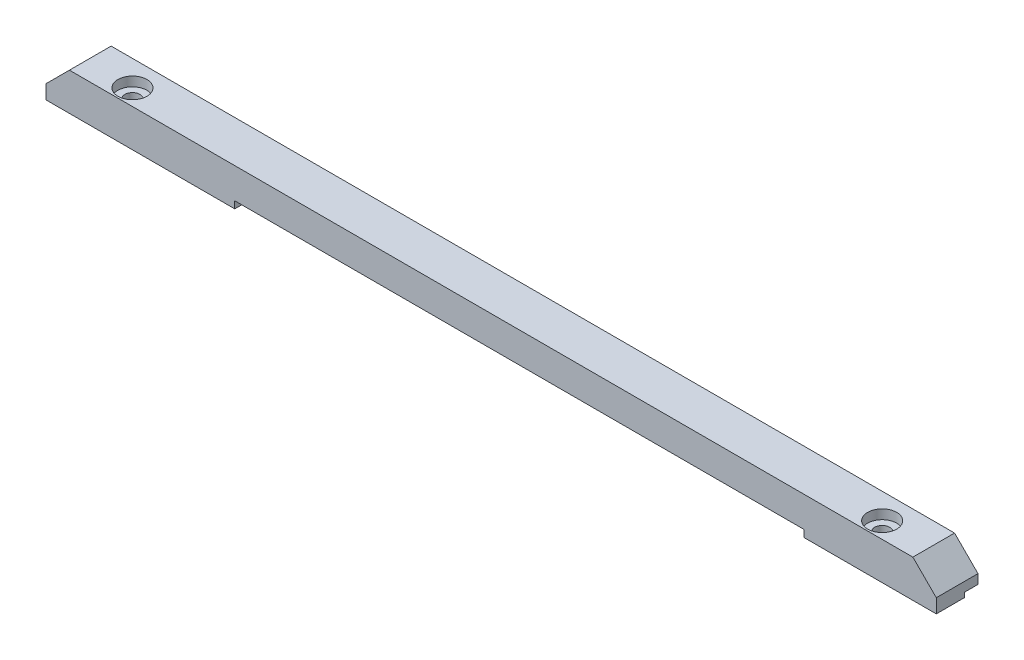
ISO-10303-21;
HEADER;
FILE_DESCRIPTION(('STEP AP214'),'2;1');
FILE_NAME('part.step','',(''),(''),'','','');
FILE_SCHEMA(('AUTOMOTIVE_DESIGN { 1 0 10303 214 1 1 1 1 }'));
ENDSEC;
DATA;
#1=APPLICATION_CONTEXT('core data for automotive mechanical design processes');
#2=APPLICATION_PROTOCOL_DEFINITION('international standard','automotive_design',2000,#1);
#3=PRODUCT_CONTEXT('',#1,'mechanical');
#4=PRODUCT('Part','Part','',(#3));
#5=PRODUCT_RELATED_PRODUCT_CATEGORY('part','',(#4));
#6=PRODUCT_DEFINITION_FORMATION('','',#4);
#7=PRODUCT_DEFINITION_CONTEXT('part definition',#1,'design');
#8=PRODUCT_DEFINITION('design','',#6,#7);
#9=PRODUCT_DEFINITION_SHAPE('','',#8);
#10=(LENGTH_UNIT() NAMED_UNIT(*) SI_UNIT(.MILLI.,.METRE.));
#11=(NAMED_UNIT(*) PLANE_ANGLE_UNIT() SI_UNIT($,.RADIAN.));
#12=(NAMED_UNIT(*) SI_UNIT($,.STERADIAN.) SOLID_ANGLE_UNIT());
#13=UNCERTAINTY_MEASURE_WITH_UNIT(LENGTH_MEASURE(1.E-05),#10,'distance_accuracy_value','');
#14=(GEOMETRIC_REPRESENTATION_CONTEXT(3) GLOBAL_UNCERTAINTY_ASSIGNED_CONTEXT((#13)) GLOBAL_UNIT_ASSIGNED_CONTEXT((#10,
#11,#12)) REPRESENTATION_CONTEXT('',''));
#15=CARTESIAN_POINT('',(0.,0.,0.));
#16=DIRECTION('',(0.,0.,1.));
#17=DIRECTION('',(1.,0.,0.));
#18=AXIS2_PLACEMENT_3D('',#15,#16,#17);
#19=CARTESIAN_POINT('',(0.,0.,0.));
#20=DIRECTION('',(0.,-1.,0.));
#21=DIRECTION('',(0.,0.,-1.));
#22=AXIS2_PLACEMENT_3D('',#19,#20,#21);
#23=PLANE('',#22);
#24=CARTESIAN_POINT('',(247.17,0.,-3.45));
#25=DIRECTION('',(0.,1.,0.));
#26=DIRECTION('',(0.,0.,1.));
#27=AXIS2_PLACEMENT_3D('',#24,#25,#26);
#28=CIRCLE('',#27,1.59999999999999);
#29=CARTESIAN_POINT('',(247.17,0.,-1.85000000000001));
#30=VERTEX_POINT('',#29);
#31=EDGE_CURVE('E242',#30,#30,#28,.T.);
#32=ORIENTED_EDGE('',*,*,#31,.T.);
#33=EDGE_LOOP('',(#32));
#34=FACE_BOUND('',#33,.T.);
#35=CARTESIAN_POINT('',(262.268456012333,0.,-9.5400000000001));
#36=DIRECTION('',(0.,-1.,0.));
#37=DIRECTION('',(0.,0.,-1.));
#38=AXIS2_PLACEMENT_3D('',#35,#36,#37);
#39=CIRCLE('',#38,3.50000000000002);
#40=CARTESIAN_POINT('',(262.17,0.,-6.04138507211283));
#41=VERTEX_POINT('',#40);
#42=CARTESIAN_POINT('',(258.827467782187,0.,-8.9));
#43=VERTEX_POINT('',#42);
#44=EDGE_CURVE('E210',#41,#43,#39,.T.);
#45=ORIENTED_EDGE('',*,*,#44,.F.);
#46=DIRECTION('',(0.,0.,-1.));
#47=VECTOR('',#46,1.);
#48=CARTESIAN_POINT('',(262.17,0.,-30.6891340642296));
#49=LINE('',#48,#47);
#50=CARTESIAN_POINT('',(262.17,0.,0.));
#51=VERTEX_POINT('',#50);
#52=EDGE_CURVE('E169',#51,#41,#49,.T.);
#53=ORIENTED_EDGE('',*,*,#52,.F.);
#54=DIRECTION('',(1.,0.,0.));
#55=VECTOR('',#54,1.);
#56=CARTESIAN_POINT('',(0.,0.,0.));
#57=LINE('',#56,#55);
#58=CARTESIAN_POINT('',(233.95,0.,0.));
#59=VERTEX_POINT('',#58);
#60=EDGE_CURVE('E253',#59,#51,#57,.T.);
#61=ORIENTED_EDGE('',*,*,#60,.F.);
#62=DIRECTION('',(0.,0.,-1.));
#63=VECTOR('',#62,1.);
#64=CARTESIAN_POINT('',(233.95,0.,0.));
#65=LINE('',#64,#63);
#66=CARTESIAN_POINT('',(233.95,0.,-8.9));
#67=VERTEX_POINT('',#66);
#68=EDGE_CURVE('E238',#59,#67,#65,.T.);
#69=ORIENTED_EDGE('',*,*,#68,.T.);
#70=DIRECTION('',(1.,0.,0.));
#71=VECTOR('',#70,1.);
#72=CARTESIAN_POINT('',(0.,0.,-8.9));
#73=LINE('',#72,#71);
#74=EDGE_CURVE('E179',#67,#43,#73,.T.);
#75=ORIENTED_EDGE('',*,*,#74,.T.);
#76=EDGE_LOOP('',(#45,#53,#61,#69,#75));
#77=FACE_BOUND('',#76,.T.);
#78=ADVANCED_FACE('F49',(#34,#77),#23,.T.);
#79=CARTESIAN_POINT('',(87.17,0.,-3.45));
#80=DIRECTION('',(0.,1.,0.));
#81=DIRECTION('',(0.,0.,1.));
#82=AXIS2_PLACEMENT_3D('',#79,#80,#81);
#83=CIRCLE('',#82,1.6);
#84=CARTESIAN_POINT('',(87.17,0.,-1.85));
#85=VERTEX_POINT('',#84);
#86=EDGE_CURVE('E250',#85,#85,#83,.T.);
#87=ORIENTED_EDGE('',*,*,#86,.T.);
#88=EDGE_LOOP('',(#87));
#89=FACE_BOUND('',#88,.T.);
#90=CARTESIAN_POINT('',(72.17,0.,0.));
#91=VERTEX_POINT('',#90);
#92=CARTESIAN_POINT('',(112.45,0.,0.));
#93=VERTEX_POINT('',#92);
#94=EDGE_CURVE('E168',#91,#93,#57,.T.);
#95=ORIENTED_EDGE('',*,*,#94,.F.);
#96=DIRECTION('',(0.,0.,1.));
#97=VECTOR('',#96,1.);
#98=CARTESIAN_POINT('',(72.17,0.,-30.6891340642296));
#99=LINE('',#98,#97);
#100=CARTESIAN_POINT('',(72.17,0.,-8.9));
#101=VERTEX_POINT('',#100);
#102=EDGE_CURVE('E154',#101,#91,#99,.T.);
#103=ORIENTED_EDGE('',*,*,#102,.F.);
#104=CARTESIAN_POINT('',(88.6474677821872,0.,-8.9));
#105=VERTEX_POINT('',#104);
#106=EDGE_CURVE('E165',#101,#105,#73,.T.);
#107=ORIENTED_EDGE('',*,*,#106,.T.);
#108=CARTESIAN_POINT('',(92.0884560123327,0.,-9.5400000000001));
#109=DIRECTION('',(0.,-1.,0.));
#110=DIRECTION('',(0.,0.,-1.));
#111=AXIS2_PLACEMENT_3D('',#108,#109,#110);
#112=CIRCLE('',#111,3.50000000000001);
#113=CARTESIAN_POINT('',(95.5294442424782,0.,-8.9));
#114=VERTEX_POINT('',#113);
#115=EDGE_CURVE('E307',#114,#105,#112,.T.);
#116=ORIENTED_EDGE('',*,*,#115,.F.);
#117=CARTESIAN_POINT('',(112.45,0.,-8.9));
#118=VERTEX_POINT('',#117);
#119=EDGE_CURVE('E177',#114,#118,#73,.T.);
#120=ORIENTED_EDGE('',*,*,#119,.T.);
#121=DIRECTION('',(0.,0.,-1.));
#122=VECTOR('',#121,1.);
#123=CARTESIAN_POINT('',(112.45,0.,0.));
#124=LINE('',#123,#122);
#125=EDGE_CURVE('E245',#93,#118,#124,.T.);
#126=ORIENTED_EDGE('',*,*,#125,.F.);
#127=EDGE_LOOP('',(#95,#103,#107,#116,#120,#126));
#128=FACE_BOUND('',#127,.T.);
#129=ADVANCED_FACE('F164',(#89,#128),#23,.T.);
#130=CARTESIAN_POINT('',(0.,8.,0.));
#131=DIRECTION('',(0.,-1.,0.));
#132=DIRECTION('',(0.,0.,-1.));
#133=AXIS2_PLACEMENT_3D('',#130,#131,#132);
#134=PLANE('',#133);
#135=CARTESIAN_POINT('',(247.17,8.,-3.45));
#136=DIRECTION('',(0.,1.,0.));
#137=DIRECTION('',(0.,0.,1.));
#138=AXIS2_PLACEMENT_3D('',#135,#136,#137);
#139=CIRCLE('',#138,3.09999999999999);
#140=CARTESIAN_POINT('',(247.17,8.,-0.350000000000012));
#141=VERTEX_POINT('',#140);
#142=EDGE_CURVE('E321',#141,#141,#139,.T.);
#143=ORIENTED_EDGE('',*,*,#142,.F.);
#144=EDGE_LOOP('',(#143));
#145=FACE_BOUND('',#144,.T.);
#146=CARTESIAN_POINT('',(87.17,8.,-3.45));
#147=DIRECTION('',(0.,1.,0.));
#148=DIRECTION('',(0.,0.,1.));
#149=AXIS2_PLACEMENT_3D('',#146,#147,#148);
#150=CIRCLE('',#149,3.1);
#151=CARTESIAN_POINT('',(87.17,8.,-0.349999999999998));
#152=VERTEX_POINT('',#151);
#153=EDGE_CURVE('E176',#152,#152,#150,.T.);
#154=ORIENTED_EDGE('',*,*,#153,.F.);
#155=EDGE_LOOP('',(#154));
#156=FACE_BOUND('',#155,.T.);
#157=DIRECTION('',(1.,0.,0.));
#158=VECTOR('',#157,1.);
#159=CARTESIAN_POINT('',(0.,8.,0.));
#160=LINE('',#159,#158);
#161=CARTESIAN_POINT('',(77.17,8.,0.));
#162=VERTEX_POINT('',#161);
#163=CARTESIAN_POINT('',(257.17,8.,0.));
#164=VERTEX_POINT('',#163);
#165=EDGE_CURVE('E254',#162,#164,#160,.T.);
#166=ORIENTED_EDGE('',*,*,#165,.T.);
#167=DIRECTION('',(0.,0.,-1.));
#168=VECTOR('',#167,1.);
#169=CARTESIAN_POINT('',(257.17,8.,-8.9));
#170=LINE('',#169,#168);
#171=CARTESIAN_POINT('',(257.17,8.,-8.9));
#172=VERTEX_POINT('',#171);
#173=EDGE_CURVE('E274',#164,#172,#170,.T.);
#174=ORIENTED_EDGE('',*,*,#173,.T.);
#175=DIRECTION('',(1.,0.,0.));
#176=VECTOR('',#175,1.);
#177=CARTESIAN_POINT('',(41.9,8.,-8.9));
#178=LINE('',#177,#176);
#179=CARTESIAN_POINT('',(77.17,8.,-8.9));
#180=VERTEX_POINT('',#179);
#181=EDGE_CURVE('E227',#180,#172,#178,.T.);
#182=ORIENTED_EDGE('',*,*,#181,.F.);
#183=DIRECTION('',(0.,0.,1.));
#184=VECTOR('',#183,1.);
#185=CARTESIAN_POINT('',(77.17,8.,0.));
#186=LINE('',#185,#184);
#187=EDGE_CURVE('E159',#180,#162,#186,.T.);
#188=ORIENTED_EDGE('',*,*,#187,.T.);
#189=EDGE_LOOP('',(#166,#174,#182,#188));
#190=FACE_BOUND('',#189,.T.);
#191=ADVANCED_FACE('F287',(#145,#156,#190),#134,.F.);
#192=CARTESIAN_POINT('',(0.,8.,0.));
#193=DIRECTION('',(0.,0.,-1.));
#194=DIRECTION('',(-1.,0.,0.));
#195=AXIS2_PLACEMENT_3D('',#192,#193,#194);
#196=PLANE('',#195);
#197=DIRECTION('',(0.,-1.,0.));
#198=VECTOR('',#197,1.);
#199=CARTESIAN_POINT('',(262.17,8.,0.));
#200=LINE('',#199,#198);
#201=CARTESIAN_POINT('',(262.17,2.99999999999997,0.));
#202=VERTEX_POINT('',#201);
#203=EDGE_CURVE('E192',#202,#51,#200,.T.);
#204=ORIENTED_EDGE('',*,*,#203,.F.);
#205=DIRECTION('',(-0.707106781186549,0.707106781186546,0.));
#206=VECTOR('',#205,1.);
#207=CARTESIAN_POINT('',(257.17,8.,0.));
#208=LINE('',#207,#206);
#209=EDGE_CURVE('E58',#202,#164,#208,.T.);
#210=ORIENTED_EDGE('',*,*,#209,.T.);
#211=ORIENTED_EDGE('',*,*,#165,.F.);
#212=DIRECTION('',(-0.707106781186548,-0.707106781186548,0.));
#213=VECTOR('',#212,1.);
#214=CARTESIAN_POINT('',(77.17,8.,0.));
#215=LINE('',#214,#213);
#216=CARTESIAN_POINT('',(72.17,2.99999999999997,0.));
#217=VERTEX_POINT('',#216);
#218=EDGE_CURVE('E65',#162,#217,#215,.T.);
#219=ORIENTED_EDGE('',*,*,#218,.T.);
#220=DIRECTION('',(0.,1.,0.));
#221=VECTOR('',#220,1.);
#222=CARTESIAN_POINT('',(72.17,8.,0.));
#223=LINE('',#222,#221);
#224=EDGE_CURVE('E187',#91,#217,#223,.T.);
#225=ORIENTED_EDGE('',*,*,#224,.F.);
#226=ORIENTED_EDGE('',*,*,#94,.T.);
#227=DIRECTION('',(0.,1.,0.));
#228=VECTOR('',#227,1.);
#229=CARTESIAN_POINT('',(112.45,0.,0.));
#230=LINE('',#229,#228);
#231=CARTESIAN_POINT('',(112.45,1.5,0.));
#232=VERTEX_POINT('',#231);
#233=EDGE_CURVE('E232',#93,#232,#230,.T.);
#234=ORIENTED_EDGE('',*,*,#233,.T.);
#235=DIRECTION('',(1.,0.,0.));
#236=VECTOR('',#235,1.);
#237=CARTESIAN_POINT('',(233.95,1.5,0.));
#238=LINE('',#237,#236);
#239=CARTESIAN_POINT('',(233.95,1.5,0.));
#240=VERTEX_POINT('',#239);
#241=EDGE_CURVE('E235',#232,#240,#238,.T.);
#242=ORIENTED_EDGE('',*,*,#241,.T.);
#243=DIRECTION('',(0.,-1.,0.));
#244=VECTOR('',#243,1.);
#245=CARTESIAN_POINT('',(233.95,0.,0.));
#246=LINE('',#245,#244);
#247=EDGE_CURVE('E229',#240,#59,#246,.T.);
#248=ORIENTED_EDGE('',*,*,#247,.T.);
#249=ORIENTED_EDGE('',*,*,#60,.T.);
#250=EDGE_LOOP('',(#204,#210,#211,#219,#225,#226,#234,#242,#248,#249));
#251=FACE_BOUND('',#250,.T.);
#252=ADVANCED_FACE('F283',(#251),#196,.F.);
#253=CARTESIAN_POINT('',(0.,0.,-8.9));
#254=DIRECTION('',(0.,0.,-1.));
#255=DIRECTION('',(-1.,0.,0.));
#256=AXIS2_PLACEMENT_3D('',#253,#254,#255);
#257=PLANE('',#256);
#258=ORIENTED_EDGE('',*,*,#181,.T.);
#259=DIRECTION('',(0.707106781186549,-0.707106781186546,0.));
#260=VECTOR('',#259,1.);
#261=CARTESIAN_POINT('',(132.584999999999,132.585,-8.9));
#262=LINE('',#261,#260);
#263=CARTESIAN_POINT('',(262.17,2.99999999999997,-8.9));
#264=VERTEX_POINT('',#263);
#265=EDGE_CURVE('E279',#172,#264,#262,.T.);
#266=ORIENTED_EDGE('',*,*,#265,.T.);
#267=DIRECTION('',(0.,-1.,0.));
#268=VECTOR('',#267,1.);
#269=CARTESIAN_POINT('',(262.17,0.,-8.9));
#270=LINE('',#269,#268);
#271=CARTESIAN_POINT('',(262.17,1.,-8.9));
#272=VERTEX_POINT('',#271);
#273=EDGE_CURVE('E193',#264,#272,#270,.T.);
#274=ORIENTED_EDGE('',*,*,#273,.T.);
#275=DIRECTION('',(-1.,0.,0.));
#276=VECTOR('',#275,1.);
#277=CARTESIAN_POINT('',(0.,1.,-8.9));
#278=LINE('',#277,#276);
#279=CARTESIAN_POINT('',(258.827467782187,1.,-8.9));
#280=VERTEX_POINT('',#279);
#281=EDGE_CURVE('E257',#272,#280,#278,.T.);
#282=ORIENTED_EDGE('',*,*,#281,.T.);
#283=DIRECTION('',(0.,-1.,0.));
#284=VECTOR('',#283,1.);
#285=CARTESIAN_POINT('',(258.827467782187,1.,-8.9));
#286=LINE('',#285,#284);
#287=EDGE_CURVE('E260',#43,#280,#286,.F.);
#288=ORIENTED_EDGE('',*,*,#287,.F.);
#289=ORIENTED_EDGE('',*,*,#74,.F.);
#290=DIRECTION('',(0.,1.,0.));
#291=VECTOR('',#290,1.);
#292=CARTESIAN_POINT('',(233.95,0.,-8.9));
#293=LINE('',#292,#291);
#294=CARTESIAN_POINT('',(233.95,1.5,-8.9));
#295=VERTEX_POINT('',#294);
#296=EDGE_CURVE('E213',#67,#295,#293,.T.);
#297=ORIENTED_EDGE('',*,*,#296,.T.);
#298=DIRECTION('',(-1.,0.,0.));
#299=VECTOR('',#298,1.);
#300=CARTESIAN_POINT('',(233.95,1.5,-8.9));
#301=LINE('',#300,#299);
#302=CARTESIAN_POINT('',(112.45,1.5,-8.9));
#303=VERTEX_POINT('',#302);
#304=EDGE_CURVE('E216',#295,#303,#301,.T.);
#305=ORIENTED_EDGE('',*,*,#304,.T.);
#306=DIRECTION('',(0.,-1.,0.));
#307=VECTOR('',#306,1.);
#308=CARTESIAN_POINT('',(112.45,1.5,-8.9));
#309=LINE('',#308,#307);
#310=EDGE_CURVE('E224',#303,#118,#309,.T.);
#311=ORIENTED_EDGE('',*,*,#310,.T.);
#312=ORIENTED_EDGE('',*,*,#119,.F.);
#313=DIRECTION('',(0.,-1.,0.));
#314=VECTOR('',#313,1.);
#315=CARTESIAN_POINT('',(95.5294442424782,1.,-8.9));
#316=LINE('',#315,#314);
#317=CARTESIAN_POINT('',(95.5294442424782,1.,-8.9));
#318=VERTEX_POINT('',#317);
#319=EDGE_CURVE('E214',#318,#114,#316,.T.);
#320=ORIENTED_EDGE('',*,*,#319,.F.);
#321=DIRECTION('',(-1.,0.,0.));
#322=VECTOR('',#321,1.);
#323=CARTESIAN_POINT('',(0.,1.,-8.9));
#324=LINE('',#323,#322);
#325=CARTESIAN_POINT('',(88.6474677821872,1.,-8.9));
#326=VERTEX_POINT('',#325);
#327=EDGE_CURVE('E262',#318,#326,#324,.T.);
#328=ORIENTED_EDGE('',*,*,#327,.T.);
#329=DIRECTION('',(0.,-1.,0.));
#330=VECTOR('',#329,1.);
#331=CARTESIAN_POINT('',(88.6474677821872,1.,-8.9));
#332=LINE('',#331,#330);
#333=EDGE_CURVE('E175',#105,#326,#332,.F.);
#334=ORIENTED_EDGE('',*,*,#333,.F.);
#335=ORIENTED_EDGE('',*,*,#106,.F.);
#336=DIRECTION('',(0.,1.,0.));
#337=VECTOR('',#336,1.);
#338=CARTESIAN_POINT('',(72.17,0.,-8.9));
#339=LINE('',#338,#337);
#340=CARTESIAN_POINT('',(72.17,2.99999999999997,-8.9));
#341=VERTEX_POINT('',#340);
#342=EDGE_CURVE('E151',#101,#341,#339,.T.);
#343=ORIENTED_EDGE('',*,*,#342,.T.);
#344=DIRECTION('',(0.707106781186548,0.707106781186548,0.));
#345=VECTOR('',#344,1.);
#346=CARTESIAN_POINT('',(34.585,-34.585,-8.9));
#347=LINE('',#346,#345);
#348=EDGE_CURVE('E277',#341,#180,#347,.T.);
#349=ORIENTED_EDGE('',*,*,#348,.T.);
#350=EDGE_LOOP('',(#258,#266,#274,#282,#288,#289,#297,#305,#311,#312,#320,#328,#334,#335,#343,#349));
#351=FACE_BOUND('',#350,.T.);
#352=ADVANCED_FACE('F173',(#351),#257,.T.);
#353=CARTESIAN_POINT('',(262.268456012333,1.,-9.5400000000001));
#354=DIRECTION('',(0.,-1.,0.));
#355=DIRECTION('',(0.,0.,-1.));
#356=AXIS2_PLACEMENT_3D('',#353,#354,#355);
#357=CYLINDRICAL_SURFACE('',#356,3.50000000000002);
#358=DIRECTION('',(0.,-1.,0.));
#359=VECTOR('',#358,1.);
#360=CARTESIAN_POINT('',(262.17,1.,-6.04138507211282));
#361=LINE('',#360,#359);
#362=CARTESIAN_POINT('',(262.17,1.,-6.04138507211282));
#363=VERTEX_POINT('',#362);
#364=EDGE_CURVE('E197',#41,#363,#361,.F.);
#365=ORIENTED_EDGE('',*,*,#364,.F.);
#366=ORIENTED_EDGE('',*,*,#44,.T.);
#367=ORIENTED_EDGE('',*,*,#287,.T.);
#368=CARTESIAN_POINT('',(262.268456012333,1.,-9.5400000000001));
#369=DIRECTION('',(0.,-1.,0.));
#370=DIRECTION('',(0.,0.,-1.));
#371=AXIS2_PLACEMENT_3D('',#368,#369,#370);
#372=CIRCLE('',#371,3.50000000000002);
#373=EDGE_CURVE('E212',#363,#280,#372,.T.);
#374=ORIENTED_EDGE('',*,*,#373,.F.);
#375=EDGE_LOOP('',(#365,#366,#367,#374));
#376=FACE_BOUND('',#375,.T.);
#377=ADVANCED_FACE('F208',(#376),#357,.F.);
#378=CARTESIAN_POINT('',(262.268456012333,1.,-9.5400000000001));
#379=DIRECTION('',(0.,-1.,0.));
#380=DIRECTION('',(0.,0.,-1.));
#381=AXIS2_PLACEMENT_3D('',#378,#379,#380);
#382=PLANE('',#381);
#383=ORIENTED_EDGE('',*,*,#281,.F.);
#384=DIRECTION('',(0.,0.,1.));
#385=VECTOR('',#384,1.);
#386=CARTESIAN_POINT('',(262.17,1.,-9.5400000000001));
#387=LINE('',#386,#385);
#388=EDGE_CURVE('E160',#272,#363,#387,.T.);
#389=ORIENTED_EDGE('',*,*,#388,.T.);
#390=ORIENTED_EDGE('',*,*,#373,.T.);
#391=EDGE_LOOP('',(#383,#389,#390));
#392=FACE_BOUND('',#391,.T.);
#393=ADVANCED_FACE('F293',(#392),#382,.T.);
#394=CARTESIAN_POINT('',(87.17,8.,-3.45));
#395=DIRECTION('',(0.,1.,0.));
#396=DIRECTION('',(0.,0.,1.));
#397=AXIS2_PLACEMENT_3D('',#394,#395,#396);
#398=CYLINDRICAL_SURFACE('',#397,1.6);
#399=ORIENTED_EDGE('',*,*,#86,.F.);
#400=EDGE_LOOP('',(#399));
#401=FACE_BOUND('',#400,.T.);
#402=CARTESIAN_POINT('',(87.17,6.,-3.45));
#403=DIRECTION('',(0.,1.,0.));
#404=DIRECTION('',(0.,0.,1.));
#405=AXIS2_PLACEMENT_3D('',#402,#403,#404);
#406=CIRCLE('',#405,1.6);
#407=CARTESIAN_POINT('',(87.17,6.,-1.85));
#408=VERTEX_POINT('',#407);
#409=EDGE_CURVE('E267',#408,#408,#406,.F.);
#410=ORIENTED_EDGE('',*,*,#409,.F.);
#411=EDGE_LOOP('',(#410));
#412=FACE_BOUND('',#411,.T.);
#413=ADVANCED_FACE('F389',(#401,#412),#398,.F.);
#414=CARTESIAN_POINT('',(247.17,8.,-3.45));
#415=DIRECTION('',(0.,1.,0.));
#416=DIRECTION('',(0.,0.,1.));
#417=AXIS2_PLACEMENT_3D('',#414,#415,#416);
#418=CYLINDRICAL_SURFACE('',#417,1.59999999999999);
#419=ORIENTED_EDGE('',*,*,#31,.F.);
#420=EDGE_LOOP('',(#419));
#421=FACE_BOUND('',#420,.T.);
#422=CARTESIAN_POINT('',(247.17,6.,-3.45));
#423=DIRECTION('',(0.,1.,0.));
#424=DIRECTION('',(0.,0.,1.));
#425=AXIS2_PLACEMENT_3D('',#422,#423,#424);
#426=CIRCLE('',#425,1.59999999999999);
#427=CARTESIAN_POINT('',(247.17,6.,-1.85000000000001));
#428=VERTEX_POINT('',#427);
#429=EDGE_CURVE('E264',#428,#428,#426,.F.);
#430=ORIENTED_EDGE('',*,*,#429,.F.);
#431=EDGE_LOOP('',(#430));
#432=FACE_BOUND('',#431,.T.);
#433=ADVANCED_FACE('F400',(#421,#432),#418,.F.);
#434=CARTESIAN_POINT('',(233.95,0.,0.));
#435=DIRECTION('',(1.,0.,0.));
#436=DIRECTION('',(0.,0.,-1.));
#437=AXIS2_PLACEMENT_3D('',#434,#435,#436);
#438=PLANE('',#437);
#439=ORIENTED_EDGE('',*,*,#296,.F.);
#440=ORIENTED_EDGE('',*,*,#68,.F.);
#441=ORIENTED_EDGE('',*,*,#247,.F.);
#442=DIRECTION('',(0.,0.,-1.));
#443=VECTOR('',#442,1.);
#444=CARTESIAN_POINT('',(233.95,1.5,0.));
#445=LINE('',#444,#443);
#446=EDGE_CURVE('E239',#240,#295,#445,.T.);
#447=ORIENTED_EDGE('',*,*,#446,.T.);
#448=EDGE_LOOP('',(#439,#440,#441,#447));
#449=FACE_BOUND('',#448,.T.);
#450=ADVANCED_FACE('F296',(#449),#438,.F.);
#451=CARTESIAN_POINT('',(233.95,1.5,0.));
#452=DIRECTION('',(0.,1.,0.));
#453=DIRECTION('',(0.,0.,1.));
#454=AXIS2_PLACEMENT_3D('',#451,#452,#453);
#455=PLANE('',#454);
#456=DIRECTION('',(0.,0.,-1.));
#457=VECTOR('',#456,1.);
#458=CARTESIAN_POINT('',(112.45,1.5,0.));
#459=LINE('',#458,#457);
#460=EDGE_CURVE('E243',#232,#303,#459,.T.);
#461=ORIENTED_EDGE('',*,*,#460,.T.);
#462=ORIENTED_EDGE('',*,*,#304,.F.);
#463=ORIENTED_EDGE('',*,*,#446,.F.);
#464=ORIENTED_EDGE('',*,*,#241,.F.);
#465=EDGE_LOOP('',(#461,#462,#463,#464));
#466=FACE_BOUND('',#465,.T.);
#467=ADVANCED_FACE('F300',(#466),#455,.F.);
#468=CARTESIAN_POINT('',(112.45,0.,0.));
#469=DIRECTION('',(-1.,0.,0.));
#470=DIRECTION('',(0.,0.,1.));
#471=AXIS2_PLACEMENT_3D('',#468,#469,#470);
#472=PLANE('',#471);
#473=ORIENTED_EDGE('',*,*,#125,.T.);
#474=ORIENTED_EDGE('',*,*,#310,.F.);
#475=ORIENTED_EDGE('',*,*,#460,.F.);
#476=ORIENTED_EDGE('',*,*,#233,.F.);
#477=EDGE_LOOP('',(#473,#474,#475,#476));
#478=FACE_BOUND('',#477,.T.);
#479=ADVANCED_FACE('F305',(#478),#472,.F.);
#480=CARTESIAN_POINT('',(92.0884560123327,1.,-9.5400000000001));
#481=DIRECTION('',(0.,-1.,0.));
#482=DIRECTION('',(0.,0.,-1.));
#483=AXIS2_PLACEMENT_3D('',#480,#481,#482);
#484=CYLINDRICAL_SURFACE('',#483,3.50000000000001);
#485=ORIENTED_EDGE('',*,*,#115,.T.);
#486=ORIENTED_EDGE('',*,*,#333,.T.);
#487=CARTESIAN_POINT('',(92.0884560123327,1.,-9.5400000000001));
#488=DIRECTION('',(0.,-1.,0.));
#489=DIRECTION('',(0.,0.,-1.));
#490=AXIS2_PLACEMENT_3D('',#487,#488,#489);
#491=CIRCLE('',#490,3.50000000000001);
#492=EDGE_CURVE('E313',#318,#326,#491,.T.);
#493=ORIENTED_EDGE('',*,*,#492,.F.);
#494=ORIENTED_EDGE('',*,*,#319,.T.);
#495=EDGE_LOOP('',(#485,#486,#493,#494));
#496=FACE_BOUND('',#495,.T.);
#497=ADVANCED_FACE('F311',(#496),#484,.F.);
#498=CARTESIAN_POINT('',(92.0884560123327,1.,-9.5400000000001));
#499=DIRECTION('',(0.,-1.,0.));
#500=DIRECTION('',(0.,0.,-1.));
#501=AXIS2_PLACEMENT_3D('',#498,#499,#500);
#502=PLANE('',#501);
#503=ORIENTED_EDGE('',*,*,#492,.T.);
#504=ORIENTED_EDGE('',*,*,#327,.F.);
#505=EDGE_LOOP('',(#503,#504));
#506=FACE_BOUND('',#505,.T.);
#507=ADVANCED_FACE('F378',(#506),#502,.T.);
#508=CARTESIAN_POINT('',(247.17,6.,-3.45));
#509=DIRECTION('',(0.,1.,0.));
#510=DIRECTION('',(0.,0.,1.));
#511=AXIS2_PLACEMENT_3D('',#508,#509,#510);
#512=PLANE('',#511);
#513=CARTESIAN_POINT('',(247.17,6.,-3.45));
#514=DIRECTION('',(0.,1.,0.));
#515=DIRECTION('',(0.,0.,1.));
#516=AXIS2_PLACEMENT_3D('',#513,#514,#515);
#517=CIRCLE('',#516,3.09999999999999);
#518=CARTESIAN_POINT('',(247.17,6.,-0.350000000000012));
#519=VERTEX_POINT('',#518);
#520=EDGE_CURVE('E268',#519,#519,#517,.T.);
#521=ORIENTED_EDGE('',*,*,#520,.T.);
#522=EDGE_LOOP('',(#521));
#523=FACE_BOUND('',#522,.T.);
#524=ORIENTED_EDGE('',*,*,#429,.T.);
#525=EDGE_LOOP('',(#524));
#526=FACE_BOUND('',#525,.T.);
#527=ADVANCED_FACE('F326',(#523,#526),#512,.T.);
#528=CARTESIAN_POINT('',(247.17,6.,-3.45));
#529=DIRECTION('',(0.,1.,0.));
#530=DIRECTION('',(0.,0.,1.));
#531=AXIS2_PLACEMENT_3D('',#528,#529,#530);
#532=CYLINDRICAL_SURFACE('',#531,3.09999999999999);
#533=ORIENTED_EDGE('',*,*,#520,.F.);
#534=EDGE_LOOP('',(#533));
#535=FACE_BOUND('',#534,.T.);
#536=ORIENTED_EDGE('',*,*,#142,.T.);
#537=EDGE_LOOP('',(#536));
#538=FACE_BOUND('',#537,.T.);
#539=ADVANCED_FACE('F329',(#535,#538),#532,.F.);
#540=CARTESIAN_POINT('',(87.17,6.,-3.45));
#541=DIRECTION('',(0.,1.,0.));
#542=DIRECTION('',(0.,0.,1.));
#543=AXIS2_PLACEMENT_3D('',#540,#541,#542);
#544=PLANE('',#543);
#545=CARTESIAN_POINT('',(87.17,6.,-3.45));
#546=DIRECTION('',(0.,1.,0.));
#547=DIRECTION('',(0.,0.,1.));
#548=AXIS2_PLACEMENT_3D('',#545,#546,#547);
#549=CIRCLE('',#548,3.1);
#550=CARTESIAN_POINT('',(87.17,6.,-0.349999999999998));
#551=VERTEX_POINT('',#550);
#552=EDGE_CURVE('E181',#551,#551,#549,.T.);
#553=ORIENTED_EDGE('',*,*,#552,.T.);
#554=EDGE_LOOP('',(#553));
#555=FACE_BOUND('',#554,.T.);
#556=ORIENTED_EDGE('',*,*,#409,.T.);
#557=EDGE_LOOP('',(#556));
#558=FACE_BOUND('',#557,.T.);
#559=ADVANCED_FACE('F332',(#555,#558),#544,.T.);
#560=CARTESIAN_POINT('',(87.17,6.,-3.45));
#561=DIRECTION('',(0.,1.,0.));
#562=DIRECTION('',(0.,0.,1.));
#563=AXIS2_PLACEMENT_3D('',#560,#561,#562);
#564=CYLINDRICAL_SURFACE('',#563,3.1);
#565=ORIENTED_EDGE('',*,*,#552,.F.);
#566=EDGE_LOOP('',(#565));
#567=FACE_BOUND('',#566,.T.);
#568=ORIENTED_EDGE('',*,*,#153,.T.);
#569=EDGE_LOOP('',(#568));
#570=FACE_BOUND('',#569,.T.);
#571=ADVANCED_FACE('F341',(#567,#570),#564,.F.);
#572=CARTESIAN_POINT('',(262.17,0.,-30.6891340642296));
#573=DIRECTION('',(1.,0.,0.));
#574=DIRECTION('',(0.,0.,-1.));
#575=AXIS2_PLACEMENT_3D('',#572,#573,#574);
#576=PLANE('',#575);
#577=ORIENTED_EDGE('',*,*,#273,.F.);
#578=DIRECTION('',(0.,0.,1.));
#579=VECTOR('',#578,1.);
#580=CARTESIAN_POINT('',(262.17,2.99999999999997,0.));
#581=LINE('',#580,#579);
#582=EDGE_CURVE('E73',#264,#202,#581,.T.);
#583=ORIENTED_EDGE('',*,*,#582,.T.);
#584=ORIENTED_EDGE('',*,*,#203,.T.);
#585=ORIENTED_EDGE('',*,*,#52,.T.);
#586=ORIENTED_EDGE('',*,*,#364,.T.);
#587=ORIENTED_EDGE('',*,*,#388,.F.);
#588=EDGE_LOOP('',(#577,#583,#584,#585,#586,#587));
#589=FACE_BOUND('',#588,.T.);
#590=ADVANCED_FACE('F201',(#589),#576,.T.);
#591=CARTESIAN_POINT('',(72.17,0.,-30.6891340642296));
#592=DIRECTION('',(-1.,0.,0.));
#593=DIRECTION('',(0.,0.,1.));
#594=AXIS2_PLACEMENT_3D('',#591,#592,#593);
#595=PLANE('',#594);
#596=ORIENTED_EDGE('',*,*,#224,.T.);
#597=DIRECTION('',(0.,0.,-1.));
#598=VECTOR('',#597,1.);
#599=CARTESIAN_POINT('',(72.17,2.99999999999997,-8.9));
#600=LINE('',#599,#598);
#601=EDGE_CURVE('E12',#217,#341,#600,.T.);
#602=ORIENTED_EDGE('',*,*,#601,.T.);
#603=ORIENTED_EDGE('',*,*,#342,.F.);
#604=ORIENTED_EDGE('',*,*,#102,.T.);
#605=EDGE_LOOP('',(#596,#602,#603,#604));
#606=FACE_BOUND('',#605,.T.);
#607=ADVANCED_FACE('F153',(#606),#595,.T.);
#608=CARTESIAN_POINT('',(257.17,8.,0.));
#609=DIRECTION('',(0.707106781186546,0.707106781186549,0.));
#610=DIRECTION('',(0.,0.,1.));
#611=AXIS2_PLACEMENT_3D('',#608,#609,#610);
#612=PLANE('',#611);
#613=ORIENTED_EDGE('',*,*,#209,.F.);
#614=ORIENTED_EDGE('',*,*,#582,.F.);
#615=ORIENTED_EDGE('',*,*,#265,.F.);
#616=ORIENTED_EDGE('',*,*,#173,.F.);
#617=EDGE_LOOP('',(#613,#614,#615,#616));
#618=FACE_BOUND('',#617,.T.);
#619=ADVANCED_FACE('F290',(#618),#612,.T.);
#620=CARTESIAN_POINT('',(77.17,8.,0.));
#621=DIRECTION('',(-0.707106781186547,0.707106781186547,0.));
#622=DIRECTION('',(0.,0.,-1.));
#623=AXIS2_PLACEMENT_3D('',#620,#621,#622);
#624=PLANE('',#623);
#625=ORIENTED_EDGE('',*,*,#348,.F.);
#626=ORIENTED_EDGE('',*,*,#601,.F.);
#627=ORIENTED_EDGE('',*,*,#218,.F.);
#628=ORIENTED_EDGE('',*,*,#187,.F.);
#629=EDGE_LOOP('',(#625,#626,#627,#628));
#630=FACE_BOUND('',#629,.T.);
#631=ADVANCED_FACE('F52',(#630),#624,.T.);
#632=CLOSED_SHELL('',(#78,#129,#191,#252,#352,#377,#393,#413,#433,#450,#467,#479,#497,#507,#527,
#539,#559,#571,#590,#607,#619,#631));
#633=MANIFOLD_SOLID_BREP('B2',#632);
#634=ADVANCED_BREP_SHAPE_REPRESENTATION('',(#18,#633),#14);
#635=SHAPE_DEFINITION_REPRESENTATION(#9,#634);
ENDSEC;
END-ISO-10303-21;
